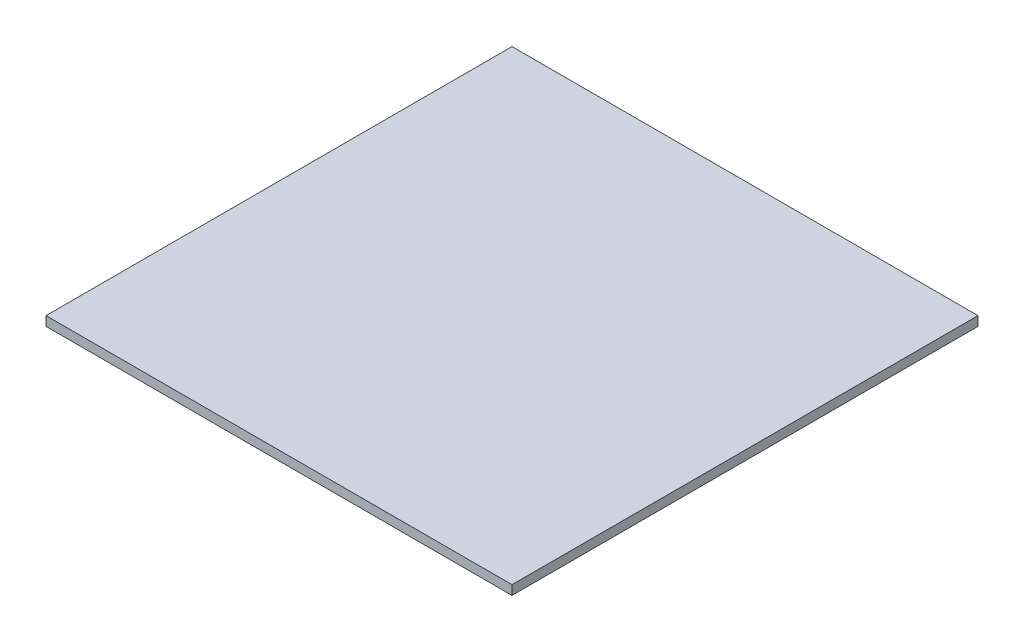
ISO-10303-21;
HEADER;
FILE_DESCRIPTION(('STEP AP214'),'2;1');
FILE_NAME('part.step','',(''),(''),'','','');
FILE_SCHEMA(('AUTOMOTIVE_DESIGN { 1 0 10303 214 1 1 1 1 }'));
ENDSEC;
DATA;
#1=APPLICATION_CONTEXT('core data for automotive mechanical design processes');
#2=APPLICATION_PROTOCOL_DEFINITION('international standard','automotive_design',2000,#1);
#3=PRODUCT_CONTEXT('',#1,'mechanical');
#4=PRODUCT('Part','Part','',(#3));
#5=PRODUCT_RELATED_PRODUCT_CATEGORY('part','',(#4));
#6=PRODUCT_DEFINITION_FORMATION('','',#4);
#7=PRODUCT_DEFINITION_CONTEXT('part definition',#1,'design');
#8=PRODUCT_DEFINITION('design','',#6,#7);
#9=PRODUCT_DEFINITION_SHAPE('','',#8);
#10=(LENGTH_UNIT() NAMED_UNIT(*) SI_UNIT(.MILLI.,.METRE.));
#11=(NAMED_UNIT(*) PLANE_ANGLE_UNIT() SI_UNIT($,.RADIAN.));
#12=(NAMED_UNIT(*) SI_UNIT($,.STERADIAN.) SOLID_ANGLE_UNIT());
#13=UNCERTAINTY_MEASURE_WITH_UNIT(LENGTH_MEASURE(1.E-05),#10,'distance_accuracy_value','');
#14=(GEOMETRIC_REPRESENTATION_CONTEXT(3) GLOBAL_UNCERTAINTY_ASSIGNED_CONTEXT((#13)) GLOBAL_UNIT_ASSIGNED_CONTEXT((#10,
#11,#12)) REPRESENTATION_CONTEXT('',''));
#15=CARTESIAN_POINT('',(0.,0.,0.));
#16=DIRECTION('',(0.,0.,1.));
#17=DIRECTION('',(1.,0.,0.));
#18=AXIS2_PLACEMENT_3D('',#15,#16,#17);
#19=CARTESIAN_POINT('',(0.,2.,0.));
#20=DIRECTION('',(1.,0.,0.));
#21=DIRECTION('',(0.,0.,-1.));
#22=AXIS2_PLACEMENT_3D('',#19,#20,#21);
#23=PLANE('',#22);
#24=DIRECTION('',(0.,0.,1.));
#25=VECTOR('',#24,1.);
#26=CARTESIAN_POINT('',(0.,0.,0.));
#27=LINE('',#26,#25);
#28=CARTESIAN_POINT('',(0.,0.,-100.));
#29=VERTEX_POINT('',#28);
#30=CARTESIAN_POINT('',(0.,0.,0.));
#31=VERTEX_POINT('',#30);
#32=EDGE_CURVE('E95',#29,#31,#27,.T.);
#33=ORIENTED_EDGE('',*,*,#32,.T.);
#34=DIRECTION('',(0.,-1.,0.));
#35=VECTOR('',#34,1.);
#36=CARTESIAN_POINT('',(0.,2.,0.));
#37=LINE('',#36,#35);
#38=CARTESIAN_POINT('',(0.,2.,0.));
#39=VERTEX_POINT('',#38);
#40=EDGE_CURVE('E11',#39,#31,#37,.T.);
#41=ORIENTED_EDGE('',*,*,#40,.F.);
#42=DIRECTION('',(0.,0.,1.));
#43=VECTOR('',#42,1.);
#44=CARTESIAN_POINT('',(0.,2.,0.));
#45=LINE('',#44,#43);
#46=CARTESIAN_POINT('',(0.,2.,-100.));
#47=VERTEX_POINT('',#46);
#48=EDGE_CURVE('E83',#47,#39,#45,.T.);
#49=ORIENTED_EDGE('',*,*,#48,.F.);
#50=DIRECTION('',(0.,-1.,0.));
#51=VECTOR('',#50,1.);
#52=CARTESIAN_POINT('',(0.,2.,-100.));
#53=LINE('',#52,#51);
#54=EDGE_CURVE('E91',#47,#29,#53,.T.);
#55=ORIENTED_EDGE('',*,*,#54,.T.);
#56=EDGE_LOOP('',(#33,#41,#49,#55));
#57=FACE_BOUND('',#56,.T.);
#58=ADVANCED_FACE('F32',(#57),#23,.F.);
#59=CARTESIAN_POINT('',(0.,2.,0.));
#60=DIRECTION('',(0.,0.,-1.));
#61=DIRECTION('',(-1.,0.,0.));
#62=AXIS2_PLACEMENT_3D('',#59,#60,#61);
#63=PLANE('',#62);
#64=DIRECTION('',(1.,0.,0.));
#65=VECTOR('',#64,1.);
#66=CARTESIAN_POINT('',(0.,0.,0.));
#67=LINE('',#66,#65);
#68=CARTESIAN_POINT('',(100.,0.,0.));
#69=VERTEX_POINT('',#68);
#70=EDGE_CURVE('E87',#31,#69,#67,.T.);
#71=ORIENTED_EDGE('',*,*,#70,.T.);
#72=DIRECTION('',(0.,-1.,0.));
#73=VECTOR('',#72,1.);
#74=CARTESIAN_POINT('',(100.,2.,0.));
#75=LINE('',#74,#73);
#76=CARTESIAN_POINT('',(100.,2.,0.));
#77=VERTEX_POINT('',#76);
#78=EDGE_CURVE('E40',#77,#69,#75,.T.);
#79=ORIENTED_EDGE('',*,*,#78,.F.);
#80=DIRECTION('',(1.,0.,0.));
#81=VECTOR('',#80,1.);
#82=CARTESIAN_POINT('',(0.,2.,0.));
#83=LINE('',#82,#81);
#84=EDGE_CURVE('E78',#39,#77,#83,.T.);
#85=ORIENTED_EDGE('',*,*,#84,.F.);
#86=ORIENTED_EDGE('',*,*,#40,.T.);
#87=EDGE_LOOP('',(#71,#79,#85,#86));
#88=FACE_BOUND('',#87,.T.);
#89=ADVANCED_FACE('F86',(#88),#63,.F.);
#90=CARTESIAN_POINT('',(100.,2.,0.));
#91=DIRECTION('',(-1.,0.,0.));
#92=DIRECTION('',(0.,0.,1.));
#93=AXIS2_PLACEMENT_3D('',#90,#91,#92);
#94=PLANE('',#93);
#95=DIRECTION('',(0.,0.,-1.));
#96=VECTOR('',#95,1.);
#97=CARTESIAN_POINT('',(100.,0.,0.));
#98=LINE('',#97,#96);
#99=CARTESIAN_POINT('',(100.,0.,-100.));
#100=VERTEX_POINT('',#99);
#101=EDGE_CURVE('E65',#69,#100,#98,.T.);
#102=ORIENTED_EDGE('',*,*,#101,.T.);
#103=DIRECTION('',(0.,-1.,0.));
#104=VECTOR('',#103,1.);
#105=CARTESIAN_POINT('',(100.,2.,-100.));
#106=LINE('',#105,#104);
#107=CARTESIAN_POINT('',(100.,2.,-100.));
#108=VERTEX_POINT('',#107);
#109=EDGE_CURVE('E88',#108,#100,#106,.T.);
#110=ORIENTED_EDGE('',*,*,#109,.F.);
#111=DIRECTION('',(0.,0.,-1.));
#112=VECTOR('',#111,1.);
#113=CARTESIAN_POINT('',(100.,2.,0.));
#114=LINE('',#113,#112);
#115=EDGE_CURVE('E81',#77,#108,#114,.T.);
#116=ORIENTED_EDGE('',*,*,#115,.F.);
#117=ORIENTED_EDGE('',*,*,#78,.T.);
#118=EDGE_LOOP('',(#102,#110,#116,#117));
#119=FACE_BOUND('',#118,.T.);
#120=ADVANCED_FACE('F89',(#119),#94,.F.);
#121=CARTESIAN_POINT('',(0.,2.,-100.));
#122=DIRECTION('',(0.,0.,1.));
#123=DIRECTION('',(1.,0.,0.));
#124=AXIS2_PLACEMENT_3D('',#121,#122,#123);
#125=PLANE('',#124);
#126=DIRECTION('',(-1.,0.,0.));
#127=VECTOR('',#126,1.);
#128=CARTESIAN_POINT('',(0.,0.,-100.));
#129=LINE('',#128,#127);
#130=EDGE_CURVE('E71',#100,#29,#129,.T.);
#131=ORIENTED_EDGE('',*,*,#130,.T.);
#132=ORIENTED_EDGE('',*,*,#54,.F.);
#133=DIRECTION('',(-1.,0.,0.));
#134=VECTOR('',#133,1.);
#135=CARTESIAN_POINT('',(0.,2.,-100.));
#136=LINE('',#135,#134);
#137=EDGE_CURVE('E48',#108,#47,#136,.T.);
#138=ORIENTED_EDGE('',*,*,#137,.F.);
#139=ORIENTED_EDGE('',*,*,#109,.T.);
#140=EDGE_LOOP('',(#131,#132,#138,#139));
#141=FACE_BOUND('',#140,.T.);
#142=ADVANCED_FACE('F102',(#141),#125,.F.);
#143=CARTESIAN_POINT('',(0.,2.,0.));
#144=DIRECTION('',(0.,-1.,0.));
#145=DIRECTION('',(0.,0.,-1.));
#146=AXIS2_PLACEMENT_3D('',#143,#144,#145);
#147=PLANE('',#146);
#148=ORIENTED_EDGE('',*,*,#48,.T.);
#149=ORIENTED_EDGE('',*,*,#84,.T.);
#150=ORIENTED_EDGE('',*,*,#115,.T.);
#151=ORIENTED_EDGE('',*,*,#137,.T.);
#152=EDGE_LOOP('',(#148,#149,#150,#151));
#153=FACE_BOUND('',#152,.T.);
#154=ADVANCED_FACE('F79',(#153),#147,.F.);
#155=CARTESIAN_POINT('',(0.,0.,0.));
#156=DIRECTION('',(0.,-1.,0.));
#157=DIRECTION('',(0.,0.,-1.));
#158=AXIS2_PLACEMENT_3D('',#155,#156,#157);
#159=PLANE('',#158);
#160=ORIENTED_EDGE('',*,*,#32,.F.);
#161=ORIENTED_EDGE('',*,*,#130,.F.);
#162=ORIENTED_EDGE('',*,*,#101,.F.);
#163=ORIENTED_EDGE('',*,*,#70,.F.);
#164=EDGE_LOOP('',(#160,#161,#162,#163));
#165=FACE_BOUND('',#164,.T.);
#166=ADVANCED_FACE('F105',(#165),#159,.T.);
#167=CLOSED_SHELL('',(#58,#89,#120,#142,#154,#166));
#168=MANIFOLD_SOLID_BREP('B2',#167);
#169=ADVANCED_BREP_SHAPE_REPRESENTATION('',(#18,#168),#14);
#170=SHAPE_DEFINITION_REPRESENTATION(#9,#169);
ENDSEC;
END-ISO-10303-21;
